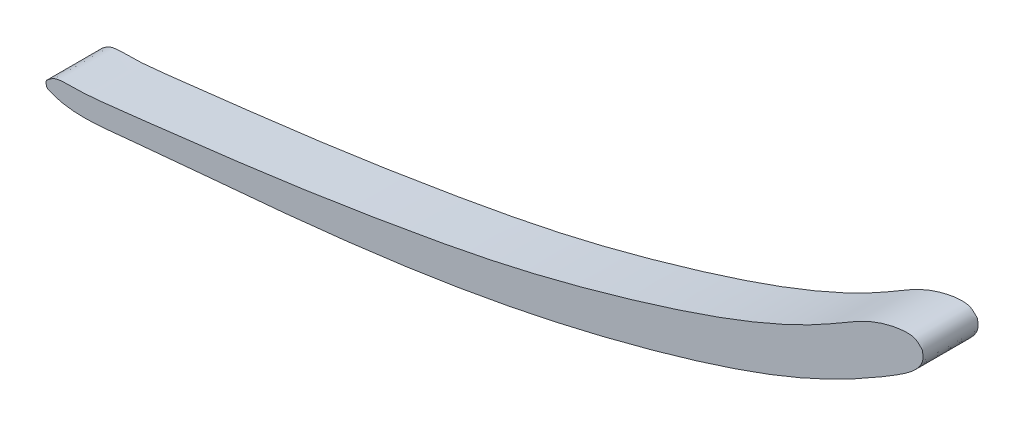
ISO-10303-21;
HEADER;
FILE_DESCRIPTION(('STEP AP214'),'2;1');
FILE_NAME('part.step','',(''),(''),'','','');
FILE_SCHEMA(('AUTOMOTIVE_DESIGN { 1 0 10303 214 1 1 1 1 }'));
ENDSEC;
DATA;
#1=APPLICATION_CONTEXT('core data for automotive mechanical design processes');
#2=APPLICATION_PROTOCOL_DEFINITION('international standard','automotive_design',2000,#1);
#3=PRODUCT_CONTEXT('',#1,'mechanical');
#4=PRODUCT('Part','Part','',(#3));
#5=PRODUCT_RELATED_PRODUCT_CATEGORY('part','',(#4));
#6=PRODUCT_DEFINITION_FORMATION('','',#4);
#7=PRODUCT_DEFINITION_CONTEXT('part definition',#1,'design');
#8=PRODUCT_DEFINITION('design','',#6,#7);
#9=PRODUCT_DEFINITION_SHAPE('','',#8);
#10=(LENGTH_UNIT() NAMED_UNIT(*) SI_UNIT(.MILLI.,.METRE.));
#11=(NAMED_UNIT(*) PLANE_ANGLE_UNIT() SI_UNIT($,.RADIAN.));
#12=(NAMED_UNIT(*) SI_UNIT($,.STERADIAN.) SOLID_ANGLE_UNIT());
#13=UNCERTAINTY_MEASURE_WITH_UNIT(LENGTH_MEASURE(1.E-05),#10,'distance_accuracy_value','');
#14=(GEOMETRIC_REPRESENTATION_CONTEXT(3) GLOBAL_UNCERTAINTY_ASSIGNED_CONTEXT((#13)) GLOBAL_UNIT_ASSIGNED_CONTEXT((#10,
#11,#12)) REPRESENTATION_CONTEXT('',''));
#15=CARTESIAN_POINT('',(0.,0.,0.));
#16=DIRECTION('',(0.,0.,1.));
#17=DIRECTION('',(1.,0.,0.));
#18=AXIS2_PLACEMENT_3D('',#15,#16,#17);
#19=CARTESIAN_POINT('',(75.315180479937,0.,348.));
#20=CARTESIAN_POINT('',(75.2846700861257,0.0833196692375617,348.));
#21=CARTESIAN_POINT('',(75.2260686095147,0.149680013110573,348.));
#22=CARTESIAN_POINT('',(75.1036471393428,0.274735014610139,348.));
#23=CARTESIAN_POINT('',(75.0387576339017,0.333397182049544,348.));
#24=CARTESIAN_POINT('',(74.847429612762,0.51289358742242,348.));
#25=CARTESIAN_POINT('',(74.7207164780845,0.634932376774416,348.));
#26=CARTESIAN_POINT('',(74.5137429422072,0.79334329777335,348.));
#27=CARTESIAN_POINT('',(74.4424533591837,0.842506070316817,348.));
#28=CARTESIAN_POINT('',(74.2913476216614,0.927324801950996,348.));
#29=CARTESIAN_POINT('',(74.2112364806898,0.963350344556319,348.));
#30=CARTESIAN_POINT('',(73.9628920870428,1.05323928636451,348.));
#31=CARTESIAN_POINT('',(73.7925638764821,1.08746020082572,348.));
#32=CARTESIAN_POINT('',(73.44722076634,1.13062092908298,348.));
#33=CARTESIAN_POINT('',(73.2715335065028,1.13893080693661,348.));
#34=CARTESIAN_POINT('',(72.9236172029003,1.14198520616976,348.));
#35=CARTESIAN_POINT('',(72.7504644996793,1.13659971714502,348.));
#36=CARTESIAN_POINT('',(72.2331700827217,1.10187355567034,348.));
#37=CARTESIAN_POINT('',(71.8910562493762,1.05512878556418,348.));
#38=CARTESIAN_POINT('',(70.8686470322246,0.881146017678508,348.));
#39=CARTESIAN_POINT('',(70.1911639320315,0.715144719060046,348.));
#40=CARTESIAN_POINT('',(68.8746279913644,0.314527345324197,348.));
#41=CARTESIAN_POINT('',(68.232203720587,0.077015756700853,348.));
#42=CARTESIAN_POINT('',(66.3511036534349,-0.743938137961076,348.));
#43=CARTESIAN_POINT('',(65.1551074146872,-1.42866732289335,348.));
#44=CARTESIAN_POINT('',(63.3720822308588,-2.47770609715979,348.));
#45=CARTESIAN_POINT('',(62.7790350355658,-2.82995904403147,348.));
#46=CARTESIAN_POINT('',(61.5859836274459,-3.52063532985691,348.));
#47=CARTESIAN_POINT('',(60.9867220821979,-3.86053499129789,348.));
#48=CARTESIAN_POINT('',(59.1737974392199,-4.8501376932842,348.));
#49=CARTESIAN_POINT('',(57.9447440312074,-5.46924688295771,348.));
#50=CARTESIAN_POINT('',(55.4590551746672,-6.65263590417222,348.));
#51=CARTESIAN_POINT('',(54.2027014549474,-7.21747577439806,348.));
#52=CARTESIAN_POINT('',(51.669965042794,-8.3073406317793,348.));
#53=CARTESIAN_POINT('',(50.3927981416675,-8.83182158878424,348.));
#54=CARTESIAN_POINT('',(47.824286796248,-9.8357806117458,348.));
#55=CARTESIAN_POINT('',(46.5324126593428,-10.3163382307586,348.));
#56=CARTESIAN_POINT('',(42.6395077162491,-11.7094153944023,348.));
#57=CARTESIAN_POINT('',(40.0217644194524,-12.5749421111491,348.));
#58=CARTESIAN_POINT('',(34.7588707042683,-14.2289311394671,348.));
#59=CARTESIAN_POINT('',(32.1148161787055,-15.0148514766584,348.));
#60=CARTESIAN_POINT('',(26.8073557373308,-16.5184184149227,348.));
#61=CARTESIAN_POINT('',(24.1451070317527,-17.2371955479476,348.));
#62=CARTESIAN_POINT('',(18.7977172291237,-18.5860493024712,348.));
#63=CARTESIAN_POINT('',(16.1111404720238,-19.214311751836,348.));
#64=CARTESIAN_POINT('',(10.7182917687147,-20.3730303168065,348.));
#65=CARTESIAN_POINT('',(8.01243129925,-20.9045758022923,348.));
#66=CARTESIAN_POINT('',(2.58878572643167,-21.907243404722,348.));
#67=CARTESIAN_POINT('',(-0.128953074128439,-22.3793458069927,348.));
#68=CARTESIAN_POINT('',(-5.56944793621058,-23.2890261056838,348.));
#69=CARTESIAN_POINT('',(-8.29257082810644,-23.7260889139167,348.));
#70=CARTESIAN_POINT('',(-13.7457242973893,-24.5575082347735,348.));
#71=CARTESIAN_POINT('',(-16.4758652244199,-24.9505709356871,348.));
#72=CARTESIAN_POINT('',(-24.6745834663864,-26.0634089323909,348.));
#73=CARTESIAN_POINT('',(-30.1519171765868,-26.719737466252,348.));
#74=CARTESIAN_POINT('',(-36.9992854604497,-27.5314246506464,348.));
#75=CARTESIAN_POINT('',(-38.3687506319131,-27.6938739945407,348.));
#76=CARTESIAN_POINT('',(-40.4236744120812,-27.9312507047377,348.));
#77=CARTESIAN_POINT('',(-41.10878887333,-28.00914801356,348.));
#78=CARTESIAN_POINT('',(-42.4792397238262,-28.1629937520228,348.));
#79=CARTESIAN_POINT('',(-43.1644363609449,-28.2404065391602,348.));
#80=CARTESIAN_POINT('',(-44.5355491834853,-28.3875330992216,348.));
#81=CARTESIAN_POINT('',(-45.2216968265953,-28.4548693830333,348.));
#82=CARTESIAN_POINT('',(-46.5977743741309,-28.5497062629849,348.));
#83=CARTESIAN_POINT('',(-47.2872308007992,-28.5777370147527,348.));
#84=CARTESIAN_POINT('',(-48.3222345657736,-28.5826654327723,348.));
#85=CARTESIAN_POINT('',(-48.6674020528147,-28.5795165626675,348.));
#86=CARTESIAN_POINT('',(-49.3569255562689,-28.5966096453051,348.));
#87=CARTESIAN_POINT('',(-49.7021173002352,-28.6144622893422,348.));
#88=CARTESIAN_POINT('',(-50.2159808882929,-28.6863571222091,348.));
#89=CARTESIAN_POINT('',(-50.3851024253603,-28.718405424519,348.));
#90=CARTESIAN_POINT('',(-50.7162348435185,-28.8090345030806,348.));
#91=CARTESIAN_POINT('',(-50.879282014687,-28.8682470685805,348.));
#92=CARTESIAN_POINT('',(-51.1890432861315,-29.0276230828988,348.));
#93=CARTESIAN_POINT('',(-51.3345051714397,-29.1234026990265,348.));
#94=CARTESIAN_POINT('',(-51.5429562052769,-29.2812561982354,348.));
#95=CARTESIAN_POINT('',(-51.611355043,-29.3353057304085,348.));
#96=CARTESIAN_POINT('',(-51.7510834084765,-29.4395370673223,348.));
#97=CARTESIAN_POINT('',(-51.8215131765271,-29.4910569883952,348.));
#98=CARTESIAN_POINT('',(-51.9186103615377,-29.5775325776057,348.));
#99=CARTESIAN_POINT('',(-51.9493389697078,-29.6081201596913,348.));
#100=CARTESIAN_POINT('',(-52.0025589550564,-29.6781628329587,348.));
#101=CARTESIAN_POINT('',(-52.0241511091435,-29.7181447396057,348.));
#102=CARTESIAN_POINT('',(-52.0628373542874,-29.8451295104354,348.));
#103=CARTESIAN_POINT('',(-52.0587164745404,-29.9362796936564,348.));
#104=CARTESIAN_POINT('',(-52.0373090723185,-30.1127151644003,348.));
#105=CARTESIAN_POINT('',(-52.022415055202,-30.2001754743151,348.));
#106=CARTESIAN_POINT('',(-51.9826951517497,-30.3733008475395,348.));
#107=CARTESIAN_POINT('',(-51.9556089857414,-30.4605709479018,348.));
#108=CARTESIAN_POINT('',(-51.8777840227377,-30.5683621462955,348.));
#109=CARTESIAN_POINT('',(-51.8459918674475,-30.6004533563951,348.));
#110=CARTESIAN_POINT('',(-51.7733044362566,-30.6513698795994,348.));
#111=CARTESIAN_POINT('',(-51.7329715453554,-30.6706574794859,348.));
#112=CARTESIAN_POINT('',(-51.608724855114,-30.7196708096679,348.));
#113=CARTESIAN_POINT('',(-51.5225041479136,-30.7423645529507,348.));
#114=CARTESIAN_POINT('',(-51.2682680060004,-30.8234796348432,348.));
#115=CARTESIAN_POINT('',(-51.101460067735,-30.8853059228489,348.));
#116=CARTESIAN_POINT('',(-50.7688252057843,-31.0132501545321,348.));
#117=CARTESIAN_POINT('',(-50.6025183283983,-31.0772641579726,348.));
#118=CARTESIAN_POINT('',(-50.2656630800762,-31.1884575150381,348.));
#119=CARTESIAN_POINT('',(-50.0950613041412,-31.2354249021834,348.));
#120=CARTESIAN_POINT('',(-49.5790298120326,-31.3595532561688,348.));
#121=CARTESIAN_POINT('',(-49.2290382818824,-31.418608209192,348.));
#122=CARTESIAN_POINT('',(-48.1707593163428,-31.5628126865216,348.));
#123=CARTESIAN_POINT('',(-47.4625875238515,-31.6079189060601,348.));
#124=CARTESIAN_POINT('',(-46.0536001340524,-31.6208536806531,348.));
#125=CARTESIAN_POINT('',(-45.3505342992943,-31.5909455456607,348.));
#126=CARTESIAN_POINT('',(-43.945541407674,-31.5021182825609,348.));
#127=CARTESIAN_POINT('',(-43.2436671210387,-31.4418548039029,348.));
#128=CARTESIAN_POINT('',(-41.8403343446597,-31.3107351921268,348.));
#129=CARTESIAN_POINT('',(-41.1388729984604,-31.2399518287847,348.));
#130=CARTESIAN_POINT('',(-39.0345910860265,-31.0250000185708,348.));
#131=CARTESIAN_POINT('',(-37.6318395186502,-30.8805983223802,348.));
#132=CARTESIAN_POINT('',(-33.421140185933,-30.4726882153176,348.));
#133=CARTESIAN_POINT('',(-30.6112599468,-30.2291431550829,348.));
#134=CARTESIAN_POINT('',(-24.9917309497218,-29.7405727393763,348.));
#135=CARTESIAN_POINT('',(-22.1820198924386,-29.4956978689247,348.));
#136=CARTESIAN_POINT('',(-13.7583614275565,-28.7006661828279,348.));
#137=CARTESIAN_POINT('',(-8.15038180623381,-28.0918615150002,348.));
#138=CARTESIAN_POINT('',(3.03161392680281,-26.6007700595774,348.));
#139=CARTESIAN_POINT('',(8.60420957677426,-25.7233473592653,348.));
#140=CARTESIAN_POINT('',(19.6880890683741,-23.6235145073552,348.));
#141=CARTESIAN_POINT('',(25.194177544095,-22.3957446765731,348.));
#142=CARTESIAN_POINT('',(33.3937274882741,-20.3087778196576,348.));
#143=CARTESIAN_POINT('',(36.1169286478922,-19.5733849150451,348.));
#144=CARTESIAN_POINT('',(41.5358839691034,-18.0145170758419,348.));
#145=CARTESIAN_POINT('',(44.2324738753381,-17.1914022126179,348.));
#146=CARTESIAN_POINT('',(49.5880753685396,-15.4178068956955,348.));
#147=CARTESIAN_POINT('',(52.2441175410399,-14.4672442506942,348.));
#148=CARTESIAN_POINT('',(57.481908528501,-12.3760597110048,348.));
#149=CARTESIAN_POINT('',(60.0634896029729,-11.2315224345252,348.));
#150=CARTESIAN_POINT('',(65.1145390355525,-8.71770616633413,348.));
#151=CARTESIAN_POINT('',(67.585186816008,-7.34900353617503,348.));
#152=CARTESIAN_POINT('',(70.6097343117451,-5.53406003736886,348.));
#153=CARTESIAN_POINT('',(71.2117033675963,-5.16580077264078,348.));
#154=CARTESIAN_POINT('',(72.1023072061727,-4.59454853276111,348.));
#155=CARTESIAN_POINT('',(72.3967061824102,-4.4003240757323,348.));
#156=CARTESIAN_POINT('',(72.9766112927244,-3.99816278782539,348.));
#157=CARTESIAN_POINT('',(73.2621789229238,-3.79130111767387,348.));
#158=CARTESIAN_POINT('',(73.8126777381143,-3.35381906359294,348.));
#159=CARTESIAN_POINT('',(74.0776149426556,-3.12292443234792,348.));
#160=CARTESIAN_POINT('',(74.5714437422367,-2.61865306696467,348.));
#161=CARTESIAN_POINT('',(74.7985919875799,-2.34375156394814,348.));
#162=CARTESIAN_POINT('',(75.0809921274403,-1.89632243229708,348.));
#163=CARTESIAN_POINT('',(75.1671703843904,-1.73952549948903,348.));
#164=CARTESIAN_POINT('',(75.3039337303681,-1.41349420966683,348.));
#165=CARTESIAN_POINT('',(75.3553909240186,-1.24547114997524,348.));
#166=CARTESIAN_POINT('',(75.3944739227157,-0.890539354266621,348.));
#167=CARTESIAN_POINT('',(75.3765148203871,-0.710477622861692,348.));
#168=CARTESIAN_POINT('',(75.3537707948706,-0.443090623972363,348.));
#169=CARTESIAN_POINT('',(75.3500147873223,-0.353801548638307,348.));
#170=CARTESIAN_POINT('',(75.3449866639381,-0.175119456540306,348.));
#171=CARTESIAN_POINT('',(75.3456908737483,-0.0833196692375557,348.));
#172=CARTESIAN_POINT('',(75.315180479937,0.,348.));
#173=B_SPLINE_CURVE_WITH_KNOTS('',3,(#19,#20,#21,#22,#23,#24,#25,#26,#27,#28,#29,#30,#31,#32,
#33,#34,#35,#36,#37,#38,#39,#40,#41,#42,#43,#44,#45,#46,#47,#48,#49,#50,#51,#52,#53,#54,#55,#56,
#57,#58,#59,#60,#61,#62,#63,#64,#65,#66,#67,#68,#69,#70,#71,#72,#73,#74,#75,#76,#77,#78,#79,#80,
#81,#82,#83,#84,#85,#86,#87,#88,#89,#90,#91,#92,#93,#94,#95,#96,#97,#98,#99,#100,#101,#102,#103,
#104,#105,#106,#107,#108,#109,#110,#111,#112,#113,#114,#115,#116,#117,#118,#119,#120,#121,#122,
#123,#124,#125,#126,#127,#128,#129,#130,#131,#132,#133,#134,#135,#136,#137,#138,#139,#140,#141,
#142,#143,#144,#145,#146,#147,#148,#149,#150,#151,#152,#153,#154,#155,#156,#157,#158,#159,#160,
#161,#162,#163,#164,#165,#166,#167,#168,#169,#170,#171,#172),.UNSPECIFIED.,.T.,.F.,(4,2,2,2,2,2,
2,2,2,2,2,2,2,2,2,2,2,2,2,2,2,2,2,2,2,2,2,2,2,2,2,2,2,2,2,2,2,2,2,2,2,2,2,2,2,2,2,2,2,2,2,2,2,2,
2,2,2,2,2,2,2,2,2,2,2,2,2,2,2,2,2,2,2,2,2,2,4),(0.,0.000976562499999994,0.00195312499999999,
0.00390624999999986,0.00488281249999974,0.00585937499999961,0.00781249999999951,
0.0097656249999994,0.0117187499999993,0.0156249999999992,0.0234374999999993,0.0312499999999993,
0.0468749999999995,0.0546874999999995,0.0624999999999995,0.0781249999999997,0.0937499999999999,
0.109375,0.125,0.156250000000001,0.187500000000001,0.218750000000001,0.250000000000001,
0.281250000000002,0.312500000000002,0.343750000000003,0.375000000000003,0.437500000000004,
0.453125000000004,0.460937500000004,0.468750000000004,0.476562500000004,0.484375000000004,
0.488281250000004,0.492187500000004,0.494140625000004,0.496093750000004,0.498046875000004,
0.499023437500004,0.500000000000004,0.500488281250004,0.500976562500004,0.501953125000004,
0.502929687500004,0.503906250000004,0.504394531250004,0.504882812500004,0.505859375000004,
0.507812500000004,0.509765625000004,0.511718750000004,0.515625000000004,0.523437500000004,
0.531250000000004,0.539062500000004,0.546875000000004,0.562500000000004,0.593750000000003,
0.625000000000003,0.687500000000002,0.750000000000002,0.812500000000001,0.843750000000001,
0.875000000000001,0.906250000000001,0.937500000000001,0.96875,0.9765625,0.98046875,0.984375,
0.98828125,0.9921875,0.994140625,0.99609375,0.998046875,0.9990234375,1.),.UNSPECIFIED.);
#174=DIRECTION('',(0.,0.,-1.));
#175=VECTOR('',#174,1.);
#176=SURFACE_OF_LINEAR_EXTRUSION('',#173,#175);
#177=CARTESIAN_POINT('',(75.315180479937,0.,348.));
#178=CARTESIAN_POINT('',(75.3456908737483,-0.0833196692375557,348.));
#179=CARTESIAN_POINT('',(75.3449866639381,-0.175119456540306,348.));
#180=CARTESIAN_POINT('',(75.3500147873223,-0.353801548638307,348.));
#181=CARTESIAN_POINT('',(75.3537707948706,-0.443090623972363,348.));
#182=CARTESIAN_POINT('',(75.3765148203871,-0.710477622861692,348.));
#183=CARTESIAN_POINT('',(75.3944739227157,-0.890539354266621,348.));
#184=CARTESIAN_POINT('',(75.3553909240186,-1.24547114997524,348.));
#185=CARTESIAN_POINT('',(75.3039337303681,-1.41349420966683,348.));
#186=CARTESIAN_POINT('',(75.1671703843904,-1.73952549948903,348.));
#187=CARTESIAN_POINT('',(75.0809921274403,-1.89632243229708,348.));
#188=CARTESIAN_POINT('',(74.7985919875799,-2.34375156394814,348.));
#189=CARTESIAN_POINT('',(74.5714437422367,-2.61865306696467,348.));
#190=CARTESIAN_POINT('',(74.0776149426556,-3.12292443234792,348.));
#191=CARTESIAN_POINT('',(73.8126777381143,-3.35381906359294,348.));
#192=CARTESIAN_POINT('',(73.2621789229238,-3.79130111767387,348.));
#193=CARTESIAN_POINT('',(72.9766112927244,-3.99816278782539,348.));
#194=CARTESIAN_POINT('',(72.3967061824102,-4.4003240757323,348.));
#195=CARTESIAN_POINT('',(72.1023072061727,-4.59454853276111,348.));
#196=CARTESIAN_POINT('',(71.2117033675963,-5.16580077264078,348.));
#197=CARTESIAN_POINT('',(70.6097343117451,-5.53406003736886,348.));
#198=CARTESIAN_POINT('',(67.585186816008,-7.34900353617503,348.));
#199=CARTESIAN_POINT('',(65.1145390355525,-8.71770616633413,348.));
#200=CARTESIAN_POINT('',(60.0634896029729,-11.2315224345252,348.));
#201=CARTESIAN_POINT('',(57.481908528501,-12.3760597110048,348.));
#202=CARTESIAN_POINT('',(52.2441175410399,-14.4672442506942,348.));
#203=CARTESIAN_POINT('',(49.5880753685396,-15.4178068956955,348.));
#204=CARTESIAN_POINT('',(44.2324738753381,-17.1914022126179,348.));
#205=CARTESIAN_POINT('',(41.5358839691034,-18.0145170758419,348.));
#206=CARTESIAN_POINT('',(36.1169286478922,-19.5733849150451,348.));
#207=CARTESIAN_POINT('',(33.3937274882741,-20.3087778196576,348.));
#208=CARTESIAN_POINT('',(25.194177544095,-22.3957446765731,348.));
#209=CARTESIAN_POINT('',(19.6880890683741,-23.6235145073552,348.));
#210=CARTESIAN_POINT('',(8.60420957677426,-25.7233473592653,348.));
#211=CARTESIAN_POINT('',(3.03161392680281,-26.6007700595774,348.));
#212=CARTESIAN_POINT('',(-8.15038180623381,-28.0918615150002,348.));
#213=CARTESIAN_POINT('',(-13.7583614275565,-28.7006661828279,348.));
#214=CARTESIAN_POINT('',(-22.1820198924386,-29.4956978689247,348.));
#215=CARTESIAN_POINT('',(-24.9917309497218,-29.7405727393763,348.));
#216=CARTESIAN_POINT('',(-30.6112599468,-30.2291431550829,348.));
#217=CARTESIAN_POINT('',(-33.421140185933,-30.4726882153176,348.));
#218=CARTESIAN_POINT('',(-37.6318395186502,-30.8805983223802,348.));
#219=CARTESIAN_POINT('',(-39.0345910860265,-31.0250000185708,348.));
#220=CARTESIAN_POINT('',(-41.1388729984604,-31.2399518287847,348.));
#221=CARTESIAN_POINT('',(-41.8403343446597,-31.3107351921268,348.));
#222=CARTESIAN_POINT('',(-43.2436671210387,-31.4418548039029,348.));
#223=CARTESIAN_POINT('',(-43.945541407674,-31.5021182825609,348.));
#224=CARTESIAN_POINT('',(-45.3505342992943,-31.5909455456607,348.));
#225=CARTESIAN_POINT('',(-46.0536001340524,-31.6208536806531,348.));
#226=CARTESIAN_POINT('',(-47.4625875238515,-31.6079189060601,348.));
#227=CARTESIAN_POINT('',(-48.1707593163428,-31.5628126865216,348.));
#228=CARTESIAN_POINT('',(-49.2290382818824,-31.418608209192,348.));
#229=CARTESIAN_POINT('',(-49.5790298120326,-31.3595532561688,348.));
#230=CARTESIAN_POINT('',(-50.0950613041412,-31.2354249021834,348.));
#231=CARTESIAN_POINT('',(-50.2656630800762,-31.1884575150381,348.));
#232=CARTESIAN_POINT('',(-50.6025183283983,-31.0772641579726,348.));
#233=CARTESIAN_POINT('',(-50.7688252057843,-31.0132501545321,348.));
#234=CARTESIAN_POINT('',(-51.101460067735,-30.8853059228489,348.));
#235=CARTESIAN_POINT('',(-51.2682680060004,-30.8234796348432,348.));
#236=CARTESIAN_POINT('',(-51.5225041479136,-30.7423645529507,348.));
#237=CARTESIAN_POINT('',(-51.608724855114,-30.7196708096679,348.));
#238=CARTESIAN_POINT('',(-51.7329715453554,-30.6706574794859,348.));
#239=CARTESIAN_POINT('',(-51.7733044362566,-30.6513698795994,348.));
#240=CARTESIAN_POINT('',(-51.8459918674475,-30.6004533563951,348.));
#241=CARTESIAN_POINT('',(-51.8777840227377,-30.5683621462955,348.));
#242=CARTESIAN_POINT('',(-51.9556089857414,-30.4605709479018,348.));
#243=CARTESIAN_POINT('',(-51.9826951517497,-30.3733008475395,348.));
#244=CARTESIAN_POINT('',(-52.022415055202,-30.2001754743151,348.));
#245=CARTESIAN_POINT('',(-52.0373090723185,-30.1127151644003,348.));
#246=CARTESIAN_POINT('',(-52.0587164745404,-29.9362796936564,348.));
#247=CARTESIAN_POINT('',(-52.0628373542874,-29.8451295104354,348.));
#248=CARTESIAN_POINT('',(-52.0241511091435,-29.7181447396057,348.));
#249=CARTESIAN_POINT('',(-52.0025589550564,-29.6781628329587,348.));
#250=CARTESIAN_POINT('',(-51.9493389697078,-29.6081201596913,348.));
#251=CARTESIAN_POINT('',(-51.9186103615377,-29.5775325776057,348.));
#252=CARTESIAN_POINT('',(-51.8215131765271,-29.4910569883952,348.));
#253=CARTESIAN_POINT('',(-51.7510834084765,-29.4395370673223,348.));
#254=CARTESIAN_POINT('',(-51.611355043,-29.3353057304085,348.));
#255=CARTESIAN_POINT('',(-51.5429562052769,-29.2812561982354,348.));
#256=CARTESIAN_POINT('',(-51.3345051714397,-29.1234026990265,348.));
#257=CARTESIAN_POINT('',(-51.1890432861315,-29.0276230828988,348.));
#258=CARTESIAN_POINT('',(-50.879282014687,-28.8682470685805,348.));
#259=CARTESIAN_POINT('',(-50.7162348435185,-28.8090345030806,348.));
#260=CARTESIAN_POINT('',(-50.3851024253603,-28.718405424519,348.));
#261=CARTESIAN_POINT('',(-50.2159808882929,-28.6863571222091,348.));
#262=CARTESIAN_POINT('',(-49.7021173002352,-28.6144622893422,348.));
#263=CARTESIAN_POINT('',(-49.3569255562689,-28.5966096453051,348.));
#264=CARTESIAN_POINT('',(-48.6674020528147,-28.5795165626675,348.));
#265=CARTESIAN_POINT('',(-48.3222345657736,-28.5826654327723,348.));
#266=CARTESIAN_POINT('',(-47.2872308007992,-28.5777370147527,348.));
#267=CARTESIAN_POINT('',(-46.5977743741309,-28.5497062629849,348.));
#268=CARTESIAN_POINT('',(-45.2216968265953,-28.4548693830333,348.));
#269=CARTESIAN_POINT('',(-44.5355491834853,-28.3875330992216,348.));
#270=CARTESIAN_POINT('',(-43.1644363609449,-28.2404065391602,348.));
#271=CARTESIAN_POINT('',(-42.4792397238262,-28.1629937520228,348.));
#272=CARTESIAN_POINT('',(-41.10878887333,-28.00914801356,348.));
#273=CARTESIAN_POINT('',(-40.4236744120812,-27.9312507047377,348.));
#274=CARTESIAN_POINT('',(-38.3687506319131,-27.6938739945407,348.));
#275=CARTESIAN_POINT('',(-36.9992854604497,-27.5314246506464,348.));
#276=CARTESIAN_POINT('',(-30.1519171765868,-26.719737466252,348.));
#277=CARTESIAN_POINT('',(-24.6745834663864,-26.0634089323909,348.));
#278=CARTESIAN_POINT('',(-16.4758652244199,-24.9505709356871,348.));
#279=CARTESIAN_POINT('',(-13.7457242973893,-24.5575082347735,348.));
#280=CARTESIAN_POINT('',(-8.29257082810644,-23.7260889139167,348.));
#281=CARTESIAN_POINT('',(-5.56944793621058,-23.2890261056838,348.));
#282=CARTESIAN_POINT('',(-0.128953074128439,-22.3793458069927,348.));
#283=CARTESIAN_POINT('',(2.58878572643167,-21.907243404722,348.));
#284=CARTESIAN_POINT('',(8.01243129925,-20.9045758022923,348.));
#285=CARTESIAN_POINT('',(10.7182917687147,-20.3730303168065,348.));
#286=CARTESIAN_POINT('',(16.1111404720238,-19.214311751836,348.));
#287=CARTESIAN_POINT('',(18.7977172291237,-18.5860493024712,348.));
#288=CARTESIAN_POINT('',(24.1451070317527,-17.2371955479476,348.));
#289=CARTESIAN_POINT('',(26.8073557373308,-16.5184184149227,348.));
#290=CARTESIAN_POINT('',(32.1148161787055,-15.0148514766584,348.));
#291=CARTESIAN_POINT('',(34.7588707042683,-14.2289311394671,348.));
#292=CARTESIAN_POINT('',(40.0217644194524,-12.5749421111491,348.));
#293=CARTESIAN_POINT('',(42.6395077162491,-11.7094153944023,348.));
#294=CARTESIAN_POINT('',(46.5324126593428,-10.3163382307586,348.));
#295=CARTESIAN_POINT('',(47.824286796248,-9.8357806117458,348.));
#296=CARTESIAN_POINT('',(50.3927981416675,-8.83182158878424,348.));
#297=CARTESIAN_POINT('',(51.669965042794,-8.3073406317793,348.));
#298=CARTESIAN_POINT('',(54.2027014549474,-7.21747577439806,348.));
#299=CARTESIAN_POINT('',(55.4590551746672,-6.65263590417222,348.));
#300=CARTESIAN_POINT('',(57.9447440312074,-5.46924688295771,348.));
#301=CARTESIAN_POINT('',(59.1737974392199,-4.8501376932842,348.));
#302=CARTESIAN_POINT('',(60.9867220821979,-3.86053499129789,348.));
#303=CARTESIAN_POINT('',(61.5859836274459,-3.52063532985691,348.));
#304=CARTESIAN_POINT('',(62.7790350355658,-2.82995904403147,348.));
#305=CARTESIAN_POINT('',(63.3720822308588,-2.47770609715979,348.));
#306=CARTESIAN_POINT('',(65.1551074146872,-1.42866732289335,348.));
#307=CARTESIAN_POINT('',(66.3511036534349,-0.743938137961076,348.));
#308=CARTESIAN_POINT('',(68.232203720587,0.077015756700853,348.));
#309=CARTESIAN_POINT('',(68.8746279913644,0.314527345324197,348.));
#310=CARTESIAN_POINT('',(70.1911639320315,0.715144719060046,348.));
#311=CARTESIAN_POINT('',(70.8686470322246,0.881146017678508,348.));
#312=CARTESIAN_POINT('',(71.8910562493762,1.05512878556418,348.));
#313=CARTESIAN_POINT('',(72.2331700827217,1.10187355567034,348.));
#314=CARTESIAN_POINT('',(72.7504644996793,1.13659971714502,348.));
#315=CARTESIAN_POINT('',(72.9236172029003,1.14198520616976,348.));
#316=CARTESIAN_POINT('',(73.2715335065028,1.13893080693661,348.));
#317=CARTESIAN_POINT('',(73.44722076634,1.13062092908298,348.));
#318=CARTESIAN_POINT('',(73.7925638764821,1.08746020082572,348.));
#319=CARTESIAN_POINT('',(73.9628920870428,1.05323928636451,348.));
#320=CARTESIAN_POINT('',(74.2112364806898,0.963350344556319,348.));
#321=CARTESIAN_POINT('',(74.2913476216614,0.927324801950996,348.));
#322=CARTESIAN_POINT('',(74.4424533591837,0.842506070316817,348.));
#323=CARTESIAN_POINT('',(74.5137429422072,0.79334329777335,348.));
#324=CARTESIAN_POINT('',(74.7207164780845,0.634932376774416,348.));
#325=CARTESIAN_POINT('',(74.847429612762,0.51289358742242,348.));
#326=CARTESIAN_POINT('',(75.0387576339017,0.333397182049544,348.));
#327=CARTESIAN_POINT('',(75.1036471393428,0.274735014610139,348.));
#328=CARTESIAN_POINT('',(75.2260686095147,0.149680013110573,348.));
#329=CARTESIAN_POINT('',(75.2846700861257,0.0833196692375617,348.));
#330=CARTESIAN_POINT('',(75.315180479937,0.,348.));
#331=B_SPLINE_CURVE_WITH_KNOTS('',3,(#177,#178,#179,#180,#181,#182,#183,#184,#185,#186,#187,
#188,#189,#190,#191,#192,#193,#194,#195,#196,#197,#198,#199,#200,#201,#202,#203,#204,#205,#206,
#207,#208,#209,#210,#211,#212,#213,#214,#215,#216,#217,#218,#219,#220,#221,#222,#223,#224,#225,
#226,#227,#228,#229,#230,#231,#232,#233,#234,#235,#236,#237,#238,#239,#240,#241,#242,#243,#244,
#245,#246,#247,#248,#249,#250,#251,#252,#253,#254,#255,#256,#257,#258,#259,#260,#261,#262,#263,
#264,#265,#266,#267,#268,#269,#270,#271,#272,#273,#274,#275,#276,#277,#278,#279,#280,#281,#282,
#283,#284,#285,#286,#287,#288,#289,#290,#291,#292,#293,#294,#295,#296,#297,#298,#299,#300,#301,
#302,#303,#304,#305,#306,#307,#308,#309,#310,#311,#312,#313,#314,#315,#316,#317,#318,#319,#320,
#321,#322,#323,#324,#325,#326,#327,#328,#329,#330),.UNSPECIFIED.,.T.,.F.,(4,2,2,2,2,2,2,2,2,2,2,
2,2,2,2,2,2,2,2,2,2,2,2,2,2,2,2,2,2,2,2,2,2,2,2,2,2,2,2,2,2,2,2,2,2,2,2,2,2,2,2,2,2,2,2,2,2,2,2,
2,2,2,2,2,2,2,2,2,2,2,2,2,2,2,2,2,4),(0.,0.0009765625,0.001953125,0.00390625,0.005859375,
0.0078125,0.0117187499999999,0.0156249999999999,0.0195312499999999,0.0234374999999999,
0.0312499999999998,0.0624999999999994,0.0937499999999993,0.124999999999999,0.156249999999999,
0.187499999999999,0.249999999999998,0.312499999999998,0.374999999999997,0.406249999999997,
0.437499999999996,0.453124999999996,0.460937499999996,0.468749999999996,0.476562499999996,
0.484374999999996,0.488281249999996,0.490234374999996,0.492187499999996,0.494140624999996,
0.495117187499996,0.495605468749996,0.496093749999996,0.497070312499996,0.498046874999996,
0.499023437499996,0.499511718749996,0.499999999999996,0.500976562499996,0.501953124999996,
0.503906249999996,0.505859374999996,0.507812499999996,0.511718749999996,0.515624999999996,
0.523437499999996,0.531249999999996,0.539062499999996,0.546874999999996,0.562499999999996,
0.624999999999997,0.656249999999997,0.687499999999998,0.718749999999998,0.749999999999998,
0.781249999999999,0.812499999999999,0.843749999999999,0.875,0.890625,0.90625,0.921875,0.9375,
0.945312500000001,0.953125000000001,0.968750000000001,0.976562500000001,0.984375000000001,
0.988281250000001,0.990234375000001,0.9921875,0.994140625,0.9951171875,0.99609375,0.998046875,
0.9990234375,1.),.UNSPECIFIED.);
#332=CARTESIAN_POINT('',(75.315180479937,0.,348.));
#333=VERTEX_POINT('',#332);
#334=EDGE_CURVE('E10',#333,#333,#331,.F.);
#335=ORIENTED_EDGE('',*,*,#334,.F.);
#336=EDGE_LOOP('',(#335));
#337=FACE_BOUND('',#336,.T.);
#338=CARTESIAN_POINT('',(75.315180479937,0.,340.000000000001));
#339=CARTESIAN_POINT('',(75.2846700861257,0.0833196692375617,340.000000000001));
#340=CARTESIAN_POINT('',(75.2260686095147,0.149680013110573,340.000000000001));
#341=CARTESIAN_POINT('',(75.1036471393428,0.274735014610139,340.000000000001));
#342=CARTESIAN_POINT('',(75.0387576339017,0.333397182049544,340.000000000001));
#343=CARTESIAN_POINT('',(74.847429612762,0.51289358742242,340.000000000001));
#344=CARTESIAN_POINT('',(74.7207164780845,0.634932376774416,340.000000000001));
#345=CARTESIAN_POINT('',(74.5137429422072,0.79334329777335,340.000000000001));
#346=CARTESIAN_POINT('',(74.4424533591837,0.842506070316817,340.000000000001));
#347=CARTESIAN_POINT('',(74.2913476216614,0.927324801950996,340.000000000001));
#348=CARTESIAN_POINT('',(74.2112364806898,0.963350344556319,340.000000000001));
#349=CARTESIAN_POINT('',(73.9628920870428,1.05323928636451,340.000000000001));
#350=CARTESIAN_POINT('',(73.7925638764821,1.08746020082572,340.000000000001));
#351=CARTESIAN_POINT('',(73.44722076634,1.13062092908298,340.000000000001));
#352=CARTESIAN_POINT('',(73.2715335065028,1.13893080693661,340.000000000001));
#353=CARTESIAN_POINT('',(72.9236172029003,1.14198520616976,340.000000000001));
#354=CARTESIAN_POINT('',(72.7504644996793,1.13659971714502,340.000000000001));
#355=CARTESIAN_POINT('',(72.2331700827217,1.10187355567034,340.000000000001));
#356=CARTESIAN_POINT('',(71.8910562493762,1.05512878556418,340.000000000001));
#357=CARTESIAN_POINT('',(70.8686470322246,0.881146017678508,340.000000000001));
#358=CARTESIAN_POINT('',(70.1911639320315,0.715144719060046,340.000000000001));
#359=CARTESIAN_POINT('',(68.8746279913644,0.314527345324197,340.000000000001));
#360=CARTESIAN_POINT('',(68.232203720587,0.077015756700853,340.000000000001));
#361=CARTESIAN_POINT('',(66.3511036534349,-0.743938137961076,340.000000000001));
#362=CARTESIAN_POINT('',(65.1551074146872,-1.42866732289335,340.000000000001));
#363=CARTESIAN_POINT('',(63.3720822308588,-2.47770609715979,340.000000000001));
#364=CARTESIAN_POINT('',(62.7790350355658,-2.82995904403147,340.000000000001));
#365=CARTESIAN_POINT('',(61.5859836274459,-3.52063532985691,340.000000000001));
#366=CARTESIAN_POINT('',(60.9867220821979,-3.86053499129789,340.000000000001));
#367=CARTESIAN_POINT('',(59.1737974392199,-4.8501376932842,340.000000000001));
#368=CARTESIAN_POINT('',(57.9447440312074,-5.46924688295771,340.000000000001));
#369=CARTESIAN_POINT('',(55.4590551746672,-6.65263590417222,340.000000000001));
#370=CARTESIAN_POINT('',(54.2027014549474,-7.21747577439806,340.000000000001));
#371=CARTESIAN_POINT('',(51.669965042794,-8.3073406317793,340.000000000001));
#372=CARTESIAN_POINT('',(50.3927981416675,-8.83182158878424,340.000000000001));
#373=CARTESIAN_POINT('',(47.824286796248,-9.8357806117458,340.000000000001));
#374=CARTESIAN_POINT('',(46.5324126593428,-10.3163382307586,340.000000000001));
#375=CARTESIAN_POINT('',(42.6395077162491,-11.7094153944023,340.000000000001));
#376=CARTESIAN_POINT('',(40.0217644194524,-12.5749421111491,340.000000000001));
#377=CARTESIAN_POINT('',(34.7588707042683,-14.2289311394671,340.000000000001));
#378=CARTESIAN_POINT('',(32.1148161787055,-15.0148514766584,340.000000000001));
#379=CARTESIAN_POINT('',(26.8073557373308,-16.5184184149227,340.000000000001));
#380=CARTESIAN_POINT('',(24.1451070317527,-17.2371955479476,340.000000000001));
#381=CARTESIAN_POINT('',(18.7977172291237,-18.5860493024712,340.000000000001));
#382=CARTESIAN_POINT('',(16.1111404720238,-19.214311751836,340.000000000001));
#383=CARTESIAN_POINT('',(10.7182917687147,-20.3730303168065,340.000000000001));
#384=CARTESIAN_POINT('',(8.01243129925,-20.9045758022923,340.000000000001));
#385=CARTESIAN_POINT('',(2.58878572643167,-21.907243404722,340.000000000001));
#386=CARTESIAN_POINT('',(-0.128953074128439,-22.3793458069927,340.000000000001));
#387=CARTESIAN_POINT('',(-5.56944793621058,-23.2890261056838,340.000000000001));
#388=CARTESIAN_POINT('',(-8.29257082810644,-23.7260889139167,340.000000000001));
#389=CARTESIAN_POINT('',(-13.7457242973893,-24.5575082347735,340.000000000001));
#390=CARTESIAN_POINT('',(-16.4758652244199,-24.9505709356871,340.000000000001));
#391=CARTESIAN_POINT('',(-24.6745834663864,-26.0634089323909,340.000000000001));
#392=CARTESIAN_POINT('',(-30.1519171765868,-26.719737466252,340.000000000001));
#393=CARTESIAN_POINT('',(-36.9992854604497,-27.5314246506464,340.000000000001));
#394=CARTESIAN_POINT('',(-38.3687506319131,-27.6938739945407,340.000000000001));
#395=CARTESIAN_POINT('',(-40.4236744120812,-27.9312507047377,340.000000000001));
#396=CARTESIAN_POINT('',(-41.10878887333,-28.00914801356,340.000000000001));
#397=CARTESIAN_POINT('',(-42.4792397238262,-28.1629937520228,340.000000000001));
#398=CARTESIAN_POINT('',(-43.1644363609449,-28.2404065391602,340.000000000001));
#399=CARTESIAN_POINT('',(-44.5355491834853,-28.3875330992216,340.000000000001));
#400=CARTESIAN_POINT('',(-45.2216968265953,-28.4548693830333,340.000000000001));
#401=CARTESIAN_POINT('',(-46.5977743741309,-28.5497062629849,340.000000000001));
#402=CARTESIAN_POINT('',(-47.2872308007992,-28.5777370147527,340.000000000001));
#403=CARTESIAN_POINT('',(-48.3222345657736,-28.5826654327723,340.000000000001));
#404=CARTESIAN_POINT('',(-48.6674020528147,-28.5795165626675,340.000000000001));
#405=CARTESIAN_POINT('',(-49.3569255562689,-28.5966096453051,340.000000000001));
#406=CARTESIAN_POINT('',(-49.7021173002352,-28.6144622893422,340.000000000001));
#407=CARTESIAN_POINT('',(-50.2159808882929,-28.6863571222091,340.000000000001));
#408=CARTESIAN_POINT('',(-50.3851024253603,-28.718405424519,340.000000000001));
#409=CARTESIAN_POINT('',(-50.7162348435185,-28.8090345030806,340.000000000001));
#410=CARTESIAN_POINT('',(-50.879282014687,-28.8682470685805,340.000000000001));
#411=CARTESIAN_POINT('',(-51.1890432861315,-29.0276230828988,340.000000000001));
#412=CARTESIAN_POINT('',(-51.3345051714397,-29.1234026990265,340.000000000001));
#413=CARTESIAN_POINT('',(-51.5429562052769,-29.2812561982354,340.000000000001));
#414=CARTESIAN_POINT('',(-51.611355043,-29.3353057304085,340.000000000001));
#415=CARTESIAN_POINT('',(-51.7510834084765,-29.4395370673223,340.000000000001));
#416=CARTESIAN_POINT('',(-51.8215131765271,-29.4910569883952,340.000000000001));
#417=CARTESIAN_POINT('',(-51.9186103615377,-29.5775325776057,340.000000000001));
#418=CARTESIAN_POINT('',(-51.9493389697078,-29.6081201596913,340.000000000001));
#419=CARTESIAN_POINT('',(-52.0025589550564,-29.6781628329587,340.000000000001));
#420=CARTESIAN_POINT('',(-52.0241511091435,-29.7181447396057,340.000000000001));
#421=CARTESIAN_POINT('',(-52.0628373542874,-29.8451295104354,340.000000000001));
#422=CARTESIAN_POINT('',(-52.0587164745404,-29.9362796936564,340.000000000001));
#423=CARTESIAN_POINT('',(-52.0373090723185,-30.1127151644003,340.000000000001));
#424=CARTESIAN_POINT('',(-52.022415055202,-30.2001754743151,340.000000000001));
#425=CARTESIAN_POINT('',(-51.9826951517497,-30.3733008475395,340.000000000001));
#426=CARTESIAN_POINT('',(-51.9556089857414,-30.4605709479018,340.000000000001));
#427=CARTESIAN_POINT('',(-51.8777840227377,-30.5683621462955,340.000000000001));
#428=CARTESIAN_POINT('',(-51.8459918674475,-30.6004533563951,340.000000000001));
#429=CARTESIAN_POINT('',(-51.7733044362566,-30.6513698795994,340.000000000001));
#430=CARTESIAN_POINT('',(-51.7329715453554,-30.6706574794859,340.000000000001));
#431=CARTESIAN_POINT('',(-51.608724855114,-30.7196708096679,340.000000000001));
#432=CARTESIAN_POINT('',(-51.5225041479136,-30.7423645529507,340.000000000001));
#433=CARTESIAN_POINT('',(-51.2682680060004,-30.8234796348432,340.000000000001));
#434=CARTESIAN_POINT('',(-51.101460067735,-30.8853059228489,340.000000000001));
#435=CARTESIAN_POINT('',(-50.7688252057843,-31.0132501545321,340.000000000001));
#436=CARTESIAN_POINT('',(-50.6025183283983,-31.0772641579726,340.000000000001));
#437=CARTESIAN_POINT('',(-50.2656630800762,-31.1884575150381,340.000000000001));
#438=CARTESIAN_POINT('',(-50.0950613041412,-31.2354249021834,340.000000000001));
#439=CARTESIAN_POINT('',(-49.5790298120326,-31.3595532561688,340.000000000001));
#440=CARTESIAN_POINT('',(-49.2290382818824,-31.418608209192,340.000000000001));
#441=CARTESIAN_POINT('',(-48.1707593163428,-31.5628126865216,340.000000000001));
#442=CARTESIAN_POINT('',(-47.4625875238515,-31.6079189060601,340.000000000001));
#443=CARTESIAN_POINT('',(-46.0536001340524,-31.6208536806531,340.000000000001));
#444=CARTESIAN_POINT('',(-45.3505342992943,-31.5909455456607,340.000000000001));
#445=CARTESIAN_POINT('',(-43.945541407674,-31.5021182825609,340.000000000001));
#446=CARTESIAN_POINT('',(-43.2436671210387,-31.4418548039029,340.000000000001));
#447=CARTESIAN_POINT('',(-41.8403343446597,-31.3107351921268,340.000000000001));
#448=CARTESIAN_POINT('',(-41.1388729984604,-31.2399518287847,340.000000000001));
#449=CARTESIAN_POINT('',(-39.0345910860265,-31.0250000185708,340.000000000001));
#450=CARTESIAN_POINT('',(-37.6318395186502,-30.8805983223802,340.000000000001));
#451=CARTESIAN_POINT('',(-33.421140185933,-30.4726882153176,340.000000000001));
#452=CARTESIAN_POINT('',(-30.6112599468,-30.2291431550829,340.000000000001));
#453=CARTESIAN_POINT('',(-24.9917309497218,-29.7405727393763,340.000000000001));
#454=CARTESIAN_POINT('',(-22.1820198924386,-29.4956978689247,340.000000000001));
#455=CARTESIAN_POINT('',(-13.7583614275565,-28.7006661828279,340.000000000001));
#456=CARTESIAN_POINT('',(-8.15038180623381,-28.0918615150002,340.000000000001));
#457=CARTESIAN_POINT('',(3.03161392680281,-26.6007700595774,340.000000000001));
#458=CARTESIAN_POINT('',(8.60420957677426,-25.7233473592653,340.000000000001));
#459=CARTESIAN_POINT('',(19.6880890683741,-23.6235145073552,340.000000000001));
#460=CARTESIAN_POINT('',(25.194177544095,-22.3957446765731,340.000000000001));
#461=CARTESIAN_POINT('',(33.3937274882741,-20.3087778196576,340.000000000001));
#462=CARTESIAN_POINT('',(36.1169286478922,-19.5733849150451,340.000000000001));
#463=CARTESIAN_POINT('',(41.5358839691034,-18.0145170758419,340.000000000001));
#464=CARTESIAN_POINT('',(44.2324738753381,-17.1914022126179,340.000000000001));
#465=CARTESIAN_POINT('',(49.5880753685396,-15.4178068956955,340.000000000001));
#466=CARTESIAN_POINT('',(52.2441175410399,-14.4672442506942,340.000000000001));
#467=CARTESIAN_POINT('',(57.481908528501,-12.3760597110048,340.000000000001));
#468=CARTESIAN_POINT('',(60.0634896029729,-11.2315224345252,340.000000000001));
#469=CARTESIAN_POINT('',(65.1145390355525,-8.71770616633413,340.000000000001));
#470=CARTESIAN_POINT('',(67.585186816008,-7.34900353617503,340.000000000001));
#471=CARTESIAN_POINT('',(70.6097343117451,-5.53406003736886,340.000000000001));
#472=CARTESIAN_POINT('',(71.2117033675963,-5.16580077264078,340.000000000001));
#473=CARTESIAN_POINT('',(72.1023072061727,-4.59454853276111,340.000000000001));
#474=CARTESIAN_POINT('',(72.3967061824102,-4.4003240757323,340.000000000001));
#475=CARTESIAN_POINT('',(72.9766112927244,-3.99816278782539,340.000000000001));
#476=CARTESIAN_POINT('',(73.2621789229238,-3.79130111767387,340.000000000001));
#477=CARTESIAN_POINT('',(73.8126777381143,-3.35381906359294,340.000000000001));
#478=CARTESIAN_POINT('',(74.0776149426556,-3.12292443234792,340.000000000001));
#479=CARTESIAN_POINT('',(74.5714437422367,-2.61865306696467,340.000000000001));
#480=CARTESIAN_POINT('',(74.7985919875799,-2.34375156394814,340.000000000001));
#481=CARTESIAN_POINT('',(75.0809921274403,-1.89632243229708,340.000000000001));
#482=CARTESIAN_POINT('',(75.1671703843904,-1.73952549948903,340.000000000001));
#483=CARTESIAN_POINT('',(75.3039337303681,-1.41349420966683,340.000000000001));
#484=CARTESIAN_POINT('',(75.3553909240186,-1.24547114997524,340.000000000001));
#485=CARTESIAN_POINT('',(75.3944739227157,-0.890539354266621,340.000000000001));
#486=CARTESIAN_POINT('',(75.3765148203871,-0.710477622861692,340.000000000001));
#487=CARTESIAN_POINT('',(75.3537707948706,-0.443090623972363,340.000000000001));
#488=CARTESIAN_POINT('',(75.3500147873223,-0.353801548638307,340.000000000001));
#489=CARTESIAN_POINT('',(75.3449866639381,-0.175119456540306,340.000000000001));
#490=CARTESIAN_POINT('',(75.3456908737483,-0.0833196692375557,340.000000000001));
#491=CARTESIAN_POINT('',(75.315180479937,0.,340.000000000001));
#492=B_SPLINE_CURVE_WITH_KNOTS('',3,(#338,#339,#340,#341,#342,#343,#344,#345,#346,#347,#348,
#349,#350,#351,#352,#353,#354,#355,#356,#357,#358,#359,#360,#361,#362,#363,#364,#365,#366,#367,
#368,#369,#370,#371,#372,#373,#374,#375,#376,#377,#378,#379,#380,#381,#382,#383,#384,#385,#386,
#387,#388,#389,#390,#391,#392,#393,#394,#395,#396,#397,#398,#399,#400,#401,#402,#403,#404,#405,
#406,#407,#408,#409,#410,#411,#412,#413,#414,#415,#416,#417,#418,#419,#420,#421,#422,#423,#424,
#425,#426,#427,#428,#429,#430,#431,#432,#433,#434,#435,#436,#437,#438,#439,#440,#441,#442,#443,
#444,#445,#446,#447,#448,#449,#450,#451,#452,#453,#454,#455,#456,#457,#458,#459,#460,#461,#462,
#463,#464,#465,#466,#467,#468,#469,#470,#471,#472,#473,#474,#475,#476,#477,#478,#479,#480,#481,
#482,#483,#484,#485,#486,#487,#488,#489,#490,#491),.UNSPECIFIED.,.T.,.F.,(4,2,2,2,2,2,2,2,2,2,2,
2,2,2,2,2,2,2,2,2,2,2,2,2,2,2,2,2,2,2,2,2,2,2,2,2,2,2,2,2,2,2,2,2,2,2,2,2,2,2,2,2,2,2,2,2,2,2,2,
2,2,2,2,2,2,2,2,2,2,2,2,2,2,2,2,2,4),(0.,0.000976562499999994,0.00195312499999999,
0.00390624999999986,0.00488281249999974,0.00585937499999961,0.00781249999999951,
0.0097656249999994,0.0117187499999993,0.0156249999999992,0.0234374999999993,0.0312499999999993,
0.0468749999999995,0.0546874999999995,0.0624999999999995,0.0781249999999997,0.0937499999999999,
0.109375,0.125,0.156250000000001,0.187500000000001,0.218750000000001,0.250000000000001,
0.281250000000002,0.312500000000002,0.343750000000003,0.375000000000003,0.437500000000004,
0.453125000000004,0.460937500000004,0.468750000000004,0.476562500000004,0.484375000000004,
0.488281250000004,0.492187500000004,0.494140625000004,0.496093750000004,0.498046875000004,
0.499023437500004,0.500000000000004,0.500488281250004,0.500976562500004,0.501953125000004,
0.502929687500004,0.503906250000004,0.504394531250004,0.504882812500004,0.505859375000004,
0.507812500000004,0.509765625000004,0.511718750000004,0.515625000000004,0.523437500000004,
0.531250000000004,0.539062500000004,0.546875000000004,0.562500000000004,0.593750000000003,
0.625000000000003,0.687500000000002,0.750000000000002,0.812500000000001,0.843750000000001,
0.875000000000001,0.906250000000001,0.937500000000001,0.96875,0.9765625,0.98046875,0.984375,
0.98828125,0.9921875,0.994140625,0.99609375,0.998046875,0.9990234375,1.),.UNSPECIFIED.);
#493=CARTESIAN_POINT('',(75.315180479937,0.,340.000000000001));
#494=VERTEX_POINT('',#493);
#495=EDGE_CURVE('E38',#494,#494,#492,.T.);
#496=ORIENTED_EDGE('',*,*,#495,.T.);
#497=EDGE_LOOP('',(#496));
#498=FACE_BOUND('',#497,.T.);
#499=ADVANCED_FACE('F28',(#337,#498),#176,.F.);
#500=CARTESIAN_POINT('',(-51.8862446332,-29.5487073812015,348.));
#501=DIRECTION('',(0.,0.,-1.));
#502=DIRECTION('',(-1.,0.,0.));
#503=AXIS2_PLACEMENT_3D('',#500,#501,#502);
#504=PLANE('',#503);
#505=ORIENTED_EDGE('',*,*,#334,.T.);
#506=EDGE_LOOP('',(#505));
#507=FACE_BOUND('',#506,.T.);
#508=ADVANCED_FACE('F69',(#507),#504,.F.);
#509=CARTESIAN_POINT('',(-51.8862446332,-29.5487073812015,340.));
#510=DIRECTION('',(0.,0.,-1.));
#511=DIRECTION('',(-1.,0.,0.));
#512=AXIS2_PLACEMENT_3D('',#509,#510,#511);
#513=PLANE('',#512);
#514=ORIENTED_EDGE('',*,*,#495,.F.);
#515=EDGE_LOOP('',(#514));
#516=FACE_BOUND('',#515,.T.);
#517=ADVANCED_FACE('F77',(#516),#513,.T.);
#518=CLOSED_SHELL('',(#499,#508,#517));
#519=MANIFOLD_SOLID_BREP('B2',#518);
#520=ADVANCED_BREP_SHAPE_REPRESENTATION('',(#18,#519),#14);
#521=SHAPE_DEFINITION_REPRESENTATION(#9,#520);
ENDSEC;
END-ISO-10303-21;
